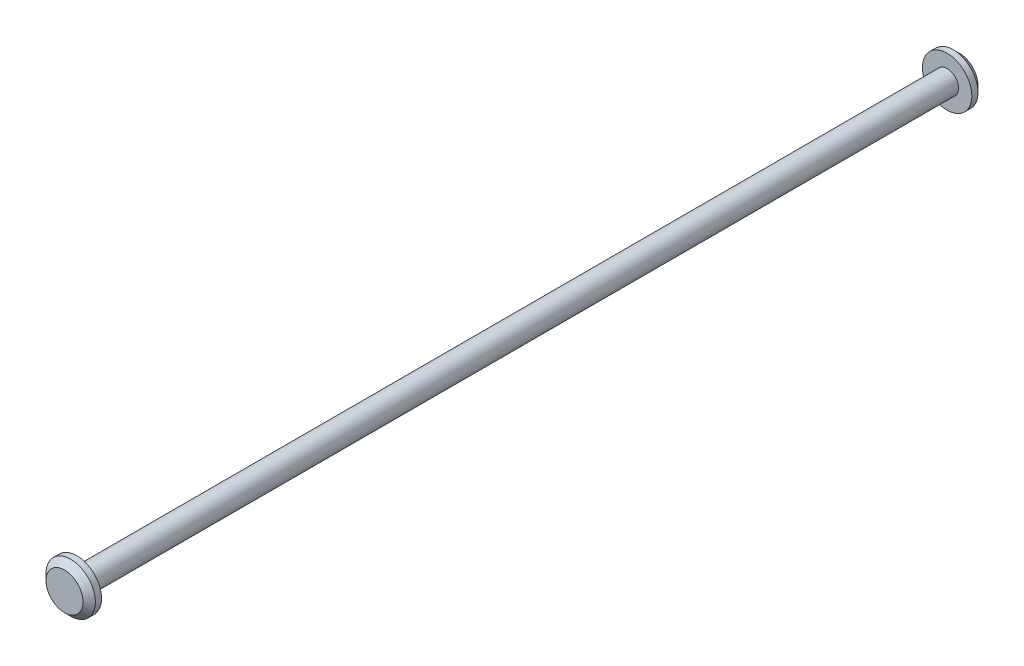
ISO-10303-21;
HEADER;
FILE_DESCRIPTION(('STEP AP214'),'2;1');
FILE_NAME('part.step','',(''),(''),'','','');
FILE_SCHEMA(('AUTOMOTIVE_DESIGN { 1 0 10303 214 1 1 1 1 }'));
ENDSEC;
DATA;
#1=APPLICATION_CONTEXT('core data for automotive mechanical design processes');
#2=APPLICATION_PROTOCOL_DEFINITION('international standard','automotive_design',2000,#1);
#3=PRODUCT_CONTEXT('',#1,'mechanical');
#4=PRODUCT('Part','Part','',(#3));
#5=PRODUCT_RELATED_PRODUCT_CATEGORY('part','',(#4));
#6=PRODUCT_DEFINITION_FORMATION('','',#4);
#7=PRODUCT_DEFINITION_CONTEXT('part definition',#1,'design');
#8=PRODUCT_DEFINITION('design','',#6,#7);
#9=PRODUCT_DEFINITION_SHAPE('','',#8);
#10=(LENGTH_UNIT() NAMED_UNIT(*) SI_UNIT(.MILLI.,.METRE.));
#11=(NAMED_UNIT(*) PLANE_ANGLE_UNIT() SI_UNIT($,.RADIAN.));
#12=(NAMED_UNIT(*) SI_UNIT($,.STERADIAN.) SOLID_ANGLE_UNIT());
#13=UNCERTAINTY_MEASURE_WITH_UNIT(LENGTH_MEASURE(1.E-05),#10,'distance_accuracy_value','');
#14=(GEOMETRIC_REPRESENTATION_CONTEXT(3) GLOBAL_UNCERTAINTY_ASSIGNED_CONTEXT((#13)) GLOBAL_UNIT_ASSIGNED_CONTEXT((#10,
#11,#12)) REPRESENTATION_CONTEXT('',''));
#15=CARTESIAN_POINT('',(0.,0.,0.));
#16=DIRECTION('',(0.,0.,1.));
#17=DIRECTION('',(1.,0.,0.));
#18=AXIS2_PLACEMENT_3D('',#15,#16,#17);
#19=CARTESIAN_POINT('',(0.,0.,35.25));
#20=DIRECTION('',(0.,0.,-1.));
#21=DIRECTION('',(-1.,0.,0.));
#22=AXIS2_PLACEMENT_3D('',#19,#20,#21);
#23=CYLINDRICAL_SURFACE('',#22,0.925);
#24=CARTESIAN_POINT('',(0.,0.,35.25));
#25=DIRECTION('',(0.,0.,1.));
#26=DIRECTION('',(1.,0.,0.));
#27=AXIS2_PLACEMENT_3D('',#24,#25,#26);
#28=CIRCLE('',#27,0.925);
#29=CARTESIAN_POINT('',(0.925,0.,35.25));
#30=VERTEX_POINT('',#29);
#31=EDGE_CURVE('E50',#30,#30,#28,.T.);
#32=ORIENTED_EDGE('',*,*,#31,.F.);
#33=EDGE_LOOP('',(#32));
#34=FACE_BOUND('',#33,.T.);
#35=CARTESIAN_POINT('',(0.,0.,-35.25));
#36=DIRECTION('',(0.,0.,1.));
#37=DIRECTION('',(1.,0.,0.));
#38=AXIS2_PLACEMENT_3D('',#35,#36,#37);
#39=CIRCLE('',#38,0.925);
#40=CARTESIAN_POINT('',(0.925,0.,-35.25));
#41=VERTEX_POINT('',#40);
#42=EDGE_CURVE('E69',#41,#41,#39,.T.);
#43=ORIENTED_EDGE('',*,*,#42,.T.);
#44=EDGE_LOOP('',(#43));
#45=FACE_BOUND('',#44,.T.);
#46=ADVANCED_FACE('F37',(#34,#45),#23,.T.);
#47=CARTESIAN_POINT('',(0.,0.,36.25));
#48=DIRECTION('',(0.,0.,-1.));
#49=DIRECTION('',(-1.,0.,0.));
#50=AXIS2_PLACEMENT_3D('',#47,#48,#49);
#51=CYLINDRICAL_SURFACE('',#50,2.);
#52=CARTESIAN_POINT('',(0.,0.,35.75));
#53=DIRECTION('',(0.,0.,1.));
#54=DIRECTION('',(1.,0.,0.));
#55=AXIS2_PLACEMENT_3D('',#52,#53,#54);
#56=CIRCLE('',#55,2.);
#57=CARTESIAN_POINT('',(2.,0.,35.75));
#58=VERTEX_POINT('',#57);
#59=EDGE_CURVE('E10',#58,#58,#56,.F.);
#60=ORIENTED_EDGE('',*,*,#59,.T.);
#61=EDGE_LOOP('',(#60));
#62=FACE_BOUND('',#61,.T.);
#63=CARTESIAN_POINT('',(0.,0.,35.25));
#64=DIRECTION('',(0.,0.,1.));
#65=DIRECTION('',(1.,0.,0.));
#66=AXIS2_PLACEMENT_3D('',#63,#64,#65);
#67=CIRCLE('',#66,2.);
#68=CARTESIAN_POINT('',(2.,0.,35.25));
#69=VERTEX_POINT('',#68);
#70=EDGE_CURVE('E55',#69,#69,#67,.T.);
#71=ORIENTED_EDGE('',*,*,#70,.T.);
#72=EDGE_LOOP('',(#71));
#73=FACE_BOUND('',#72,.T.);
#74=ADVANCED_FACE('F97',(#62,#73),#51,.T.);
#75=CARTESIAN_POINT('',(0.,0.,36.25));
#76=DIRECTION('',(0.,0.,1.));
#77=DIRECTION('',(1.,0.,0.));
#78=AXIS2_PLACEMENT_3D('',#75,#76,#77);
#79=PLANE('',#78);
#80=CARTESIAN_POINT('',(0.,0.,36.25));
#81=DIRECTION('',(0.,0.,1.));
#82=DIRECTION('',(1.,0.,0.));
#83=AXIS2_PLACEMENT_3D('',#80,#81,#82);
#84=CIRCLE('',#83,1.5);
#85=CARTESIAN_POINT('',(1.5,0.,36.25));
#86=VERTEX_POINT('',#85);
#87=EDGE_CURVE('E45',#86,#86,#84,.T.);
#88=ORIENTED_EDGE('',*,*,#87,.T.);
#89=EDGE_LOOP('',(#88));
#90=FACE_BOUND('',#89,.T.);
#91=ADVANCED_FACE('F102',(#90),#79,.T.);
#92=CARTESIAN_POINT('',(0.,0.,35.25));
#93=DIRECTION('',(0.,0.,1.));
#94=DIRECTION('',(1.,0.,0.));
#95=AXIS2_PLACEMENT_3D('',#92,#93,#94);
#96=PLANE('',#95);
#97=ORIENTED_EDGE('',*,*,#31,.T.);
#98=EDGE_LOOP('',(#97));
#99=FACE_BOUND('',#98,.T.);
#100=ORIENTED_EDGE('',*,*,#70,.F.);
#101=EDGE_LOOP('',(#100));
#102=FACE_BOUND('',#101,.T.);
#103=ADVANCED_FACE('F91',(#99,#102),#96,.F.);
#104=CARTESIAN_POINT('',(0.,0.,36.25));
#105=DIRECTION('',(0.,0.,-1.));
#106=DIRECTION('',(-1.,0.,0.));
#107=AXIS2_PLACEMENT_3D('',#104,#105,#106);
#108=CONICAL_SURFACE('',#107,1.5,0.78539816339744);
#109=ORIENTED_EDGE('',*,*,#59,.F.);
#110=EDGE_LOOP('',(#109));
#111=FACE_BOUND('',#110,.T.);
#112=ORIENTED_EDGE('',*,*,#87,.F.);
#113=EDGE_LOOP('',(#112));
#114=FACE_BOUND('',#113,.T.);
#115=ADVANCED_FACE('F39',(#111,#114),#108,.T.);
#116=CARTESIAN_POINT('',(0.,0.,-36.25));
#117=DIRECTION('',(0.,0.,1.));
#118=DIRECTION('',(-1.,0.,0.));
#119=AXIS2_PLACEMENT_3D('',#116,#117,#118);
#120=CYLINDRICAL_SURFACE('',#119,2.);
#121=CARTESIAN_POINT('',(0.,0.,-35.75));
#122=DIRECTION('',(0.,0.,1.));
#123=DIRECTION('',(1.,0.,0.));
#124=AXIS2_PLACEMENT_3D('',#121,#122,#123);
#125=CIRCLE('',#124,2.);
#126=CARTESIAN_POINT('',(2.,0.,-35.75));
#127=VERTEX_POINT('',#126);
#128=EDGE_CURVE('E61',#127,#127,#125,.F.);
#129=ORIENTED_EDGE('',*,*,#128,.F.);
#130=EDGE_LOOP('',(#129));
#131=FACE_BOUND('',#130,.T.);
#132=CARTESIAN_POINT('',(0.,0.,-35.25));
#133=DIRECTION('',(0.,0.,1.));
#134=DIRECTION('',(1.,0.,0.));
#135=AXIS2_PLACEMENT_3D('',#132,#133,#134);
#136=CIRCLE('',#135,2.);
#137=CARTESIAN_POINT('',(2.,0.,-35.25));
#138=VERTEX_POINT('',#137);
#139=EDGE_CURVE('E73',#138,#138,#136,.T.);
#140=ORIENTED_EDGE('',*,*,#139,.F.);
#141=EDGE_LOOP('',(#140));
#142=FACE_BOUND('',#141,.T.);
#143=ADVANCED_FACE('F80',(#131,#142),#120,.T.);
#144=CARTESIAN_POINT('',(0.,0.,-36.25));
#145=DIRECTION('',(0.,0.,-1.));
#146=DIRECTION('',(1.,0.,0.));
#147=AXIS2_PLACEMENT_3D('',#144,#145,#146);
#148=PLANE('',#147);
#149=CARTESIAN_POINT('',(0.,0.,-36.25));
#150=DIRECTION('',(0.,0.,1.));
#151=DIRECTION('',(1.,0.,0.));
#152=AXIS2_PLACEMENT_3D('',#149,#150,#151);
#153=CIRCLE('',#152,1.5);
#154=CARTESIAN_POINT('',(1.5,0.,-36.25));
#155=VERTEX_POINT('',#154);
#156=EDGE_CURVE('E65',#155,#155,#153,.T.);
#157=ORIENTED_EDGE('',*,*,#156,.F.);
#158=EDGE_LOOP('',(#157));
#159=FACE_BOUND('',#158,.T.);
#160=ADVANCED_FACE('F82',(#159),#148,.T.);
#161=CARTESIAN_POINT('',(0.,0.,-35.25));
#162=DIRECTION('',(0.,0.,-1.));
#163=DIRECTION('',(1.,0.,0.));
#164=AXIS2_PLACEMENT_3D('',#161,#162,#163);
#165=PLANE('',#164);
#166=ORIENTED_EDGE('',*,*,#42,.F.);
#167=EDGE_LOOP('',(#166));
#168=FACE_BOUND('',#167,.T.);
#169=ORIENTED_EDGE('',*,*,#139,.T.);
#170=EDGE_LOOP('',(#169));
#171=FACE_BOUND('',#170,.T.);
#172=ADVANCED_FACE('F78',(#168,#171),#165,.F.);
#173=CARTESIAN_POINT('',(0.,0.,-36.25));
#174=DIRECTION('',(0.,0.,1.));
#175=DIRECTION('',(-1.,0.,0.));
#176=AXIS2_PLACEMENT_3D('',#173,#174,#175);
#177=CONICAL_SURFACE('',#176,1.5,0.78539816339744);
#178=ORIENTED_EDGE('',*,*,#128,.T.);
#179=EDGE_LOOP('',(#178));
#180=FACE_BOUND('',#179,.T.);
#181=ORIENTED_EDGE('',*,*,#156,.T.);
#182=EDGE_LOOP('',(#181));
#183=FACE_BOUND('',#182,.T.);
#184=ADVANCED_FACE('F111',(#180,#183),#177,.T.);
#185=CLOSED_SHELL('',(#46,#74,#91,#103,#115,#143,#160,#172,#184));
#186=MANIFOLD_SOLID_BREP('B2',#185);
#187=ADVANCED_BREP_SHAPE_REPRESENTATION('',(#18,#186),#14);
#188=SHAPE_DEFINITION_REPRESENTATION(#9,#187);
ENDSEC;
END-ISO-10303-21;
